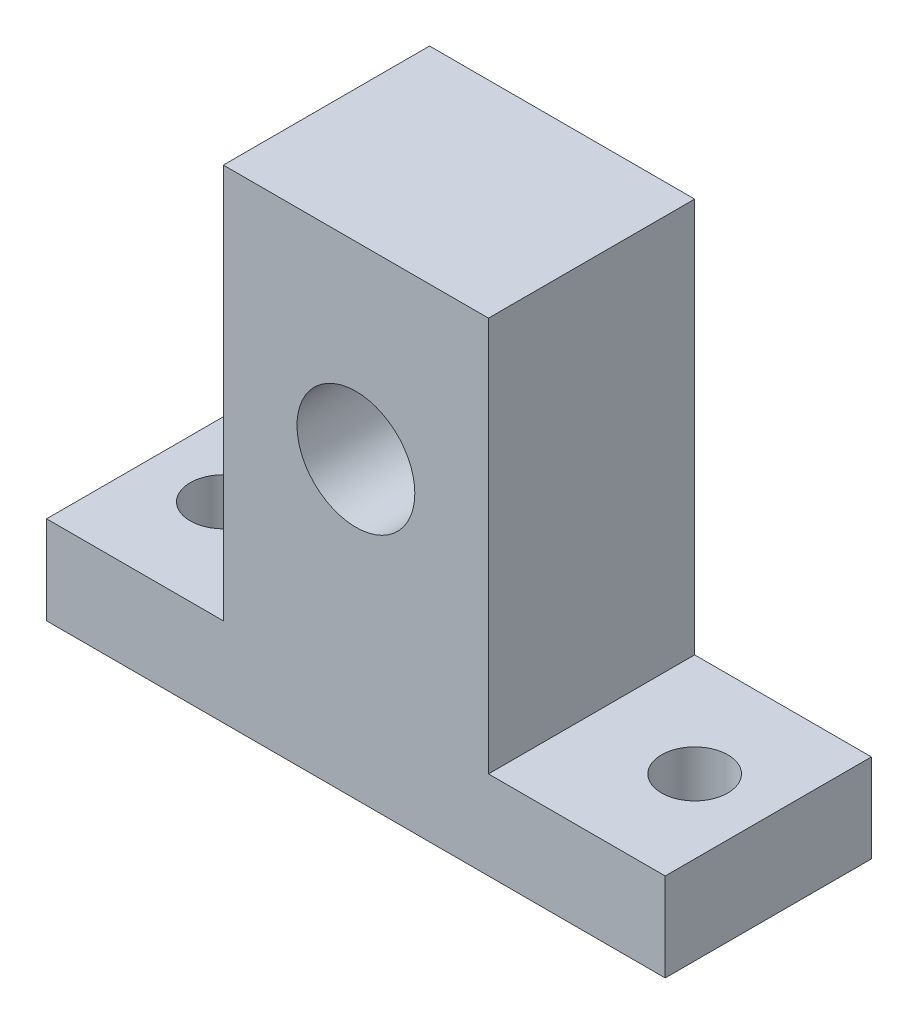
ISO-10303-21;
HEADER;
FILE_DESCRIPTION(('STEP AP214'),'2;1');
FILE_NAME('part.step','',(''),(''),'','','');
FILE_SCHEMA(('AUTOMOTIVE_DESIGN { 1 0 10303 214 1 1 1 1 }'));
ENDSEC;
DATA;
#1=APPLICATION_CONTEXT('core data for automotive mechanical design processes');
#2=APPLICATION_PROTOCOL_DEFINITION('international standard','automotive_design',2000,#1);
#3=PRODUCT_CONTEXT('',#1,'mechanical');
#4=PRODUCT('Part','Part','',(#3));
#5=PRODUCT_RELATED_PRODUCT_CATEGORY('part','',(#4));
#6=PRODUCT_DEFINITION_FORMATION('','',#4);
#7=PRODUCT_DEFINITION_CONTEXT('part definition',#1,'design');
#8=PRODUCT_DEFINITION('design','',#6,#7);
#9=PRODUCT_DEFINITION_SHAPE('','',#8);
#10=(LENGTH_UNIT() NAMED_UNIT(*) SI_UNIT(.MILLI.,.METRE.));
#11=(NAMED_UNIT(*) PLANE_ANGLE_UNIT() SI_UNIT($,.RADIAN.));
#12=(NAMED_UNIT(*) SI_UNIT($,.STERADIAN.) SOLID_ANGLE_UNIT());
#13=UNCERTAINTY_MEASURE_WITH_UNIT(LENGTH_MEASURE(1.E-05),#10,'distance_accuracy_value','');
#14=(GEOMETRIC_REPRESENTATION_CONTEXT(3) GLOBAL_UNCERTAINTY_ASSIGNED_CONTEXT((#13)) GLOBAL_UNIT_ASSIGNED_CONTEXT((#10,
#11,#12)) REPRESENTATION_CONTEXT('',''));
#15=CARTESIAN_POINT('',(0.,0.,0.));
#16=DIRECTION('',(0.,0.,1.));
#17=DIRECTION('',(1.,0.,0.));
#18=AXIS2_PLACEMENT_3D('',#15,#16,#17);
#19=CARTESIAN_POINT('',(0.,0.,14.));
#20=DIRECTION('',(0.,0.,-1.));
#21=DIRECTION('',(-1.,0.,0.));
#22=AXIS2_PLACEMENT_3D('',#19,#20,#21);
#23=PLANE('',#22);
#24=DIRECTION('',(0.,-1.,0.));
#25=VECTOR('',#24,1.);
#26=CARTESIAN_POINT('',(-9.,-14.,14.));
#27=LINE('',#26,#25);
#28=CARTESIAN_POINT('',(-9.,12.8,14.));
#29=VERTEX_POINT('',#28);
#30=CARTESIAN_POINT('',(-9.,-14.,14.));
#31=VERTEX_POINT('',#30);
#32=EDGE_CURVE('E145',#29,#31,#27,.T.);
#33=ORIENTED_EDGE('',*,*,#32,.T.);
#34=DIRECTION('',(-1.,0.,0.));
#35=VECTOR('',#34,1.);
#36=CARTESIAN_POINT('',(-21.,-14.,14.));
#37=LINE('',#36,#35);
#38=CARTESIAN_POINT('',(-21.,-14.,14.));
#39=VERTEX_POINT('',#38);
#40=EDGE_CURVE('E93',#31,#39,#37,.T.);
#41=ORIENTED_EDGE('',*,*,#40,.T.);
#42=DIRECTION('',(0.,-1.,0.));
#43=VECTOR('',#42,1.);
#44=CARTESIAN_POINT('',(-21.,-20.,14.));
#45=LINE('',#44,#43);
#46=CARTESIAN_POINT('',(-21.,-20.,14.));
#47=VERTEX_POINT('',#46);
#48=EDGE_CURVE('E160',#39,#47,#45,.T.);
#49=ORIENTED_EDGE('',*,*,#48,.T.);
#50=DIRECTION('',(1.,0.,0.));
#51=VECTOR('',#50,1.);
#52=CARTESIAN_POINT('',(21.,-20.,14.));
#53=LINE('',#52,#51);
#54=CARTESIAN_POINT('',(21.,-20.,14.));
#55=VERTEX_POINT('',#54);
#56=EDGE_CURVE('E173',#47,#55,#53,.T.);
#57=ORIENTED_EDGE('',*,*,#56,.T.);
#58=DIRECTION('',(0.,1.,0.));
#59=VECTOR('',#58,1.);
#60=CARTESIAN_POINT('',(21.,-14.,14.));
#61=LINE('',#60,#59);
#62=CARTESIAN_POINT('',(21.,-14.,14.));
#63=VERTEX_POINT('',#62);
#64=EDGE_CURVE('E112',#55,#63,#61,.T.);
#65=ORIENTED_EDGE('',*,*,#64,.T.);
#66=DIRECTION('',(-1.,0.,0.));
#67=VECTOR('',#66,1.);
#68=CARTESIAN_POINT('',(9.,-14.,14.));
#69=LINE('',#68,#67);
#70=CARTESIAN_POINT('',(9.,-14.,14.));
#71=VERTEX_POINT('',#70);
#72=EDGE_CURVE('E106',#63,#71,#69,.T.);
#73=ORIENTED_EDGE('',*,*,#72,.T.);
#74=DIRECTION('',(0.,1.,0.));
#75=VECTOR('',#74,1.);
#76=CARTESIAN_POINT('',(9.,12.8,14.));
#77=LINE('',#76,#75);
#78=CARTESIAN_POINT('',(9.,12.8,14.));
#79=VERTEX_POINT('',#78);
#80=EDGE_CURVE('E110',#71,#79,#77,.T.);
#81=ORIENTED_EDGE('',*,*,#80,.T.);
#82=DIRECTION('',(-1.,0.,0.));
#83=VECTOR('',#82,1.);
#84=CARTESIAN_POINT('',(-9.,12.8,14.));
#85=LINE('',#84,#83);
#86=EDGE_CURVE('E50',#79,#29,#85,.T.);
#87=ORIENTED_EDGE('',*,*,#86,.T.);
#88=EDGE_LOOP('',(#33,#41,#49,#57,#65,#73,#81,#87));
#89=FACE_BOUND('',#88,.T.);
#90=CARTESIAN_POINT('',(0.,0.,14.));
#91=DIRECTION('',(0.,0.,1.));
#92=DIRECTION('',(1.,0.,0.));
#93=AXIS2_PLACEMENT_3D('',#90,#91,#92);
#94=CIRCLE('',#93,4.);
#95=CARTESIAN_POINT('',(4.,0.,14.));
#96=VERTEX_POINT('',#95);
#97=EDGE_CURVE('E134',#96,#96,#94,.T.);
#98=ORIENTED_EDGE('',*,*,#97,.F.);
#99=EDGE_LOOP('',(#98));
#100=FACE_BOUND('',#99,.T.);
#101=ADVANCED_FACE('F33',(#89,#100),#23,.F.);
#102=CARTESIAN_POINT('',(0.,0.,0.));
#103=DIRECTION('',(0.,0.,-1.));
#104=DIRECTION('',(-1.,0.,0.));
#105=AXIS2_PLACEMENT_3D('',#102,#103,#104);
#106=PLANE('',#105);
#107=DIRECTION('',(0.,-1.,0.));
#108=VECTOR('',#107,1.);
#109=CARTESIAN_POINT('',(-9.,-14.,0.));
#110=LINE('',#109,#108);
#111=CARTESIAN_POINT('',(-9.,12.8,0.));
#112=VERTEX_POINT('',#111);
#113=CARTESIAN_POINT('',(-9.,-14.,0.));
#114=VERTEX_POINT('',#113);
#115=EDGE_CURVE('E130',#112,#114,#110,.T.);
#116=ORIENTED_EDGE('',*,*,#115,.F.);
#117=DIRECTION('',(-1.,0.,0.));
#118=VECTOR('',#117,1.);
#119=CARTESIAN_POINT('',(-9.,12.8,0.));
#120=LINE('',#119,#118);
#121=CARTESIAN_POINT('',(9.,12.8,0.));
#122=VERTEX_POINT('',#121);
#123=EDGE_CURVE('E85',#122,#112,#120,.T.);
#124=ORIENTED_EDGE('',*,*,#123,.F.);
#125=DIRECTION('',(0.,1.,0.));
#126=VECTOR('',#125,1.);
#127=CARTESIAN_POINT('',(9.,12.8,0.));
#128=LINE('',#127,#126);
#129=CARTESIAN_POINT('',(9.,-14.,0.));
#130=VERTEX_POINT('',#129);
#131=EDGE_CURVE('E79',#130,#122,#128,.T.);
#132=ORIENTED_EDGE('',*,*,#131,.F.);
#133=DIRECTION('',(-1.,0.,0.));
#134=VECTOR('',#133,1.);
#135=CARTESIAN_POINT('',(9.,-14.,0.));
#136=LINE('',#135,#134);
#137=CARTESIAN_POINT('',(21.,-14.,0.));
#138=VERTEX_POINT('',#137);
#139=EDGE_CURVE('E120',#138,#130,#136,.T.);
#140=ORIENTED_EDGE('',*,*,#139,.F.);
#141=DIRECTION('',(0.,1.,0.));
#142=VECTOR('',#141,1.);
#143=CARTESIAN_POINT('',(21.,-14.,0.));
#144=LINE('',#143,#142);
#145=CARTESIAN_POINT('',(21.,-20.,0.));
#146=VERTEX_POINT('',#145);
#147=EDGE_CURVE('E140',#146,#138,#144,.T.);
#148=ORIENTED_EDGE('',*,*,#147,.F.);
#149=DIRECTION('',(1.,0.,0.));
#150=VECTOR('',#149,1.);
#151=CARTESIAN_POINT('',(21.,-20.,0.));
#152=LINE('',#151,#150);
#153=CARTESIAN_POINT('',(-21.,-20.,0.));
#154=VERTEX_POINT('',#153);
#155=EDGE_CURVE('E138',#154,#146,#152,.T.);
#156=ORIENTED_EDGE('',*,*,#155,.F.);
#157=DIRECTION('',(0.,-1.,0.));
#158=VECTOR('',#157,1.);
#159=CARTESIAN_POINT('',(-21.,-20.,0.));
#160=LINE('',#159,#158);
#161=CARTESIAN_POINT('',(-21.,-14.,0.));
#162=VERTEX_POINT('',#161);
#163=EDGE_CURVE('E136',#162,#154,#160,.T.);
#164=ORIENTED_EDGE('',*,*,#163,.F.);
#165=DIRECTION('',(-1.,0.,0.));
#166=VECTOR('',#165,1.);
#167=CARTESIAN_POINT('',(-21.,-14.,0.));
#168=LINE('',#167,#166);
#169=EDGE_CURVE('E133',#114,#162,#168,.T.);
#170=ORIENTED_EDGE('',*,*,#169,.F.);
#171=EDGE_LOOP('',(#116,#124,#132,#140,#148,#156,#164,#170));
#172=FACE_BOUND('',#171,.T.);
#173=CARTESIAN_POINT('',(0.,0.,0.));
#174=DIRECTION('',(0.,0.,1.));
#175=DIRECTION('',(1.,0.,0.));
#176=AXIS2_PLACEMENT_3D('',#173,#174,#175);
#177=CIRCLE('',#176,4.);
#178=CARTESIAN_POINT('',(4.,0.,0.));
#179=VERTEX_POINT('',#178);
#180=EDGE_CURVE('E179',#179,#179,#177,.T.);
#181=ORIENTED_EDGE('',*,*,#180,.T.);
#182=EDGE_LOOP('',(#181));
#183=FACE_BOUND('',#182,.T.);
#184=ADVANCED_FACE('F164',(#172,#183),#106,.T.);
#185=CARTESIAN_POINT('',(-9.,-14.,14.));
#186=DIRECTION('',(1.,0.,0.));
#187=DIRECTION('',(0.,0.,-1.));
#188=AXIS2_PLACEMENT_3D('',#185,#186,#187);
#189=PLANE('',#188);
#190=ORIENTED_EDGE('',*,*,#115,.T.);
#191=DIRECTION('',(0.,0.,-1.));
#192=VECTOR('',#191,1.);
#193=CARTESIAN_POINT('',(-9.,-14.,14.));
#194=LINE('',#193,#192);
#195=EDGE_CURVE('E11',#31,#114,#194,.T.);
#196=ORIENTED_EDGE('',*,*,#195,.F.);
#197=ORIENTED_EDGE('',*,*,#32,.F.);
#198=DIRECTION('',(0.,0.,-1.));
#199=VECTOR('',#198,1.);
#200=CARTESIAN_POINT('',(-9.,12.8,14.));
#201=LINE('',#200,#199);
#202=EDGE_CURVE('E126',#29,#112,#201,.T.);
#203=ORIENTED_EDGE('',*,*,#202,.T.);
#204=EDGE_LOOP('',(#190,#196,#197,#203));
#205=FACE_BOUND('',#204,.T.);
#206=ADVANCED_FACE('F35',(#205),#189,.F.);
#207=CARTESIAN_POINT('',(-21.,-14.,14.));
#208=DIRECTION('',(0.,-1.,0.));
#209=DIRECTION('',(0.,0.,-1.));
#210=AXIS2_PLACEMENT_3D('',#207,#208,#209);
#211=PLANE('',#210);
#212=CARTESIAN_POINT('',(-16.,-14.,7.));
#213=DIRECTION('',(0.,1.,0.));
#214=DIRECTION('',(0.,0.,1.));
#215=AXIS2_PLACEMENT_3D('',#212,#213,#214);
#216=CIRCLE('',#215,2.25);
#217=CARTESIAN_POINT('',(-16.,-14.,9.25));
#218=VERTEX_POINT('',#217);
#219=EDGE_CURVE('E191',#218,#218,#216,.T.);
#220=ORIENTED_EDGE('',*,*,#219,.F.);
#221=EDGE_LOOP('',(#220));
#222=FACE_BOUND('',#221,.T.);
#223=ORIENTED_EDGE('',*,*,#169,.T.);
#224=DIRECTION('',(0.,0.,-1.));
#225=VECTOR('',#224,1.);
#226=CARTESIAN_POINT('',(-21.,-14.,14.));
#227=LINE('',#226,#225);
#228=EDGE_CURVE('E42',#39,#162,#227,.T.);
#229=ORIENTED_EDGE('',*,*,#228,.F.);
#230=ORIENTED_EDGE('',*,*,#40,.F.);
#231=ORIENTED_EDGE('',*,*,#195,.T.);
#232=EDGE_LOOP('',(#223,#229,#230,#231));
#233=FACE_BOUND('',#232,.T.);
#234=ADVANCED_FACE('F206',(#222,#233),#211,.F.);
#235=CARTESIAN_POINT('',(-21.,-20.,14.));
#236=DIRECTION('',(1.,0.,0.));
#237=DIRECTION('',(0.,1.,0.));
#238=AXIS2_PLACEMENT_3D('',#235,#236,#237);
#239=PLANE('',#238);
#240=ORIENTED_EDGE('',*,*,#163,.T.);
#241=DIRECTION('',(0.,0.,-1.));
#242=VECTOR('',#241,1.);
#243=CARTESIAN_POINT('',(-21.,-20.,14.));
#244=LINE('',#243,#242);
#245=EDGE_CURVE('E152',#47,#154,#244,.T.);
#246=ORIENTED_EDGE('',*,*,#245,.F.);
#247=ORIENTED_EDGE('',*,*,#48,.F.);
#248=ORIENTED_EDGE('',*,*,#228,.T.);
#249=EDGE_LOOP('',(#240,#246,#247,#248));
#250=FACE_BOUND('',#249,.T.);
#251=ADVANCED_FACE('F158',(#250),#239,.F.);
#252=CARTESIAN_POINT('',(21.,-20.,14.));
#253=DIRECTION('',(0.,1.,0.));
#254=DIRECTION('',(-1.,0.,0.));
#255=AXIS2_PLACEMENT_3D('',#252,#253,#254);
#256=PLANE('',#255);
#257=CARTESIAN_POINT('',(-16.,-20.,7.));
#258=DIRECTION('',(0.,1.,0.));
#259=DIRECTION('',(0.,0.,1.));
#260=AXIS2_PLACEMENT_3D('',#257,#258,#259);
#261=CIRCLE('',#260,2.25);
#262=CARTESIAN_POINT('',(-16.,-20.,9.25));
#263=VERTEX_POINT('',#262);
#264=EDGE_CURVE('E182',#263,#263,#261,.T.);
#265=ORIENTED_EDGE('',*,*,#264,.T.);
#266=EDGE_LOOP('',(#265));
#267=FACE_BOUND('',#266,.T.);
#268=CARTESIAN_POINT('',(16.,-20.,7.));
#269=DIRECTION('',(0.,1.,0.));
#270=DIRECTION('',(0.,0.,1.));
#271=AXIS2_PLACEMENT_3D('',#268,#269,#270);
#272=CIRCLE('',#271,2.25);
#273=CARTESIAN_POINT('',(16.,-20.,9.25));
#274=VERTEX_POINT('',#273);
#275=EDGE_CURVE('E188',#274,#274,#272,.T.);
#276=ORIENTED_EDGE('',*,*,#275,.T.);
#277=EDGE_LOOP('',(#276));
#278=FACE_BOUND('',#277,.T.);
#279=ORIENTED_EDGE('',*,*,#155,.T.);
#280=DIRECTION('',(0.,0.,-1.));
#281=VECTOR('',#280,1.);
#282=CARTESIAN_POINT('',(21.,-20.,14.));
#283=LINE('',#282,#281);
#284=EDGE_CURVE('E149',#55,#146,#283,.T.);
#285=ORIENTED_EDGE('',*,*,#284,.F.);
#286=ORIENTED_EDGE('',*,*,#56,.F.);
#287=ORIENTED_EDGE('',*,*,#245,.T.);
#288=EDGE_LOOP('',(#279,#285,#286,#287));
#289=FACE_BOUND('',#288,.T.);
#290=ADVANCED_FACE('F169',(#267,#278,#289),#256,.F.);
#291=CARTESIAN_POINT('',(21.,-14.,14.));
#292=DIRECTION('',(-1.,0.,0.));
#293=DIRECTION('',(0.,0.,1.));
#294=AXIS2_PLACEMENT_3D('',#291,#292,#293);
#295=PLANE('',#294);
#296=ORIENTED_EDGE('',*,*,#147,.T.);
#297=DIRECTION('',(0.,0.,-1.));
#298=VECTOR('',#297,1.);
#299=CARTESIAN_POINT('',(21.,-14.,14.));
#300=LINE('',#299,#298);
#301=EDGE_CURVE('E121',#63,#138,#300,.T.);
#302=ORIENTED_EDGE('',*,*,#301,.F.);
#303=ORIENTED_EDGE('',*,*,#64,.F.);
#304=ORIENTED_EDGE('',*,*,#284,.T.);
#305=EDGE_LOOP('',(#296,#302,#303,#304));
#306=FACE_BOUND('',#305,.T.);
#307=ADVANCED_FACE('F172',(#306),#295,.F.);
#308=CARTESIAN_POINT('',(9.,-14.,14.));
#309=DIRECTION('',(0.,-1.,0.));
#310=DIRECTION('',(1.,0.,0.));
#311=AXIS2_PLACEMENT_3D('',#308,#309,#310);
#312=PLANE('',#311);
#313=CARTESIAN_POINT('',(16.,-14.,7.));
#314=DIRECTION('',(0.,1.,0.));
#315=DIRECTION('',(0.,0.,1.));
#316=AXIS2_PLACEMENT_3D('',#313,#314,#315);
#317=CIRCLE('',#316,2.25);
#318=CARTESIAN_POINT('',(16.,-14.,9.25));
#319=VERTEX_POINT('',#318);
#320=EDGE_CURVE('E185',#319,#319,#317,.T.);
#321=ORIENTED_EDGE('',*,*,#320,.F.);
#322=EDGE_LOOP('',(#321));
#323=FACE_BOUND('',#322,.T.);
#324=ORIENTED_EDGE('',*,*,#139,.T.);
#325=DIRECTION('',(0.,0.,-1.));
#326=VECTOR('',#325,1.);
#327=CARTESIAN_POINT('',(9.,-14.,14.));
#328=LINE('',#327,#326);
#329=EDGE_CURVE('E117',#71,#130,#328,.T.);
#330=ORIENTED_EDGE('',*,*,#329,.F.);
#331=ORIENTED_EDGE('',*,*,#72,.F.);
#332=ORIENTED_EDGE('',*,*,#301,.T.);
#333=EDGE_LOOP('',(#324,#330,#331,#332));
#334=FACE_BOUND('',#333,.T.);
#335=ADVANCED_FACE('F118',(#323,#334),#312,.F.);
#336=CARTESIAN_POINT('',(9.,12.8,14.));
#337=DIRECTION('',(-1.,0.,0.));
#338=DIRECTION('',(0.,-1.,0.));
#339=AXIS2_PLACEMENT_3D('',#336,#337,#338);
#340=PLANE('',#339);
#341=ORIENTED_EDGE('',*,*,#131,.T.);
#342=DIRECTION('',(0.,0.,-1.));
#343=VECTOR('',#342,1.);
#344=CARTESIAN_POINT('',(9.,12.8,14.));
#345=LINE('',#344,#343);
#346=EDGE_CURVE('E122',#79,#122,#345,.T.);
#347=ORIENTED_EDGE('',*,*,#346,.F.);
#348=ORIENTED_EDGE('',*,*,#80,.F.);
#349=ORIENTED_EDGE('',*,*,#329,.T.);
#350=EDGE_LOOP('',(#341,#347,#348,#349));
#351=FACE_BOUND('',#350,.T.);
#352=ADVANCED_FACE('F124',(#351),#340,.F.);
#353=CARTESIAN_POINT('',(-9.,12.8,14.));
#354=DIRECTION('',(0.,-1.,0.));
#355=DIRECTION('',(1.,0.,0.));
#356=AXIS2_PLACEMENT_3D('',#353,#354,#355);
#357=PLANE('',#356);
#358=ORIENTED_EDGE('',*,*,#123,.T.);
#359=ORIENTED_EDGE('',*,*,#202,.F.);
#360=ORIENTED_EDGE('',*,*,#86,.F.);
#361=ORIENTED_EDGE('',*,*,#346,.T.);
#362=EDGE_LOOP('',(#358,#359,#360,#361));
#363=FACE_BOUND('',#362,.T.);
#364=ADVANCED_FACE('F211',(#363),#357,.F.);
#365=CARTESIAN_POINT('',(0.,0.,14.));
#366=DIRECTION('',(0.,0.,-1.));
#367=DIRECTION('',(-1.,0.,0.));
#368=AXIS2_PLACEMENT_3D('',#365,#366,#367);
#369=CYLINDRICAL_SURFACE('',#368,4.);
#370=ORIENTED_EDGE('',*,*,#97,.T.);
#371=EDGE_LOOP('',(#370));
#372=FACE_BOUND('',#371,.T.);
#373=ORIENTED_EDGE('',*,*,#180,.F.);
#374=EDGE_LOOP('',(#373));
#375=FACE_BOUND('',#374,.T.);
#376=ADVANCED_FACE('F213',(#372,#375),#369,.F.);
#377=CARTESIAN_POINT('',(16.,-20.,7.));
#378=DIRECTION('',(0.,1.,0.));
#379=DIRECTION('',(0.,0.,1.));
#380=AXIS2_PLACEMENT_3D('',#377,#378,#379);
#381=CYLINDRICAL_SURFACE('',#380,2.25);
#382=ORIENTED_EDGE('',*,*,#275,.F.);
#383=EDGE_LOOP('',(#382));
#384=FACE_BOUND('',#383,.T.);
#385=ORIENTED_EDGE('',*,*,#320,.T.);
#386=EDGE_LOOP('',(#385));
#387=FACE_BOUND('',#386,.T.);
#388=ADVANCED_FACE('F202',(#384,#387),#381,.F.);
#389=CARTESIAN_POINT('',(-16.,-20.,7.));
#390=DIRECTION('',(0.,1.,0.));
#391=DIRECTION('',(0.,0.,1.));
#392=AXIS2_PLACEMENT_3D('',#389,#390,#391);
#393=CYLINDRICAL_SURFACE('',#392,2.25);
#394=ORIENTED_EDGE('',*,*,#264,.F.);
#395=EDGE_LOOP('',(#394));
#396=FACE_BOUND('',#395,.T.);
#397=ORIENTED_EDGE('',*,*,#219,.T.);
#398=EDGE_LOOP('',(#397));
#399=FACE_BOUND('',#398,.T.);
#400=ADVANCED_FACE('F199',(#396,#399),#393,.F.);
#401=CLOSED_SHELL('',(#101,#184,#206,#234,#251,#290,#307,#335,#352,#364,#376,#388,#400));
#402=MANIFOLD_SOLID_BREP('B2',#401);
#403=ADVANCED_BREP_SHAPE_REPRESENTATION('',(#18,#402),#14);
#404=SHAPE_DEFINITION_REPRESENTATION(#9,#403);
ENDSEC;
END-ISO-10303-21;
